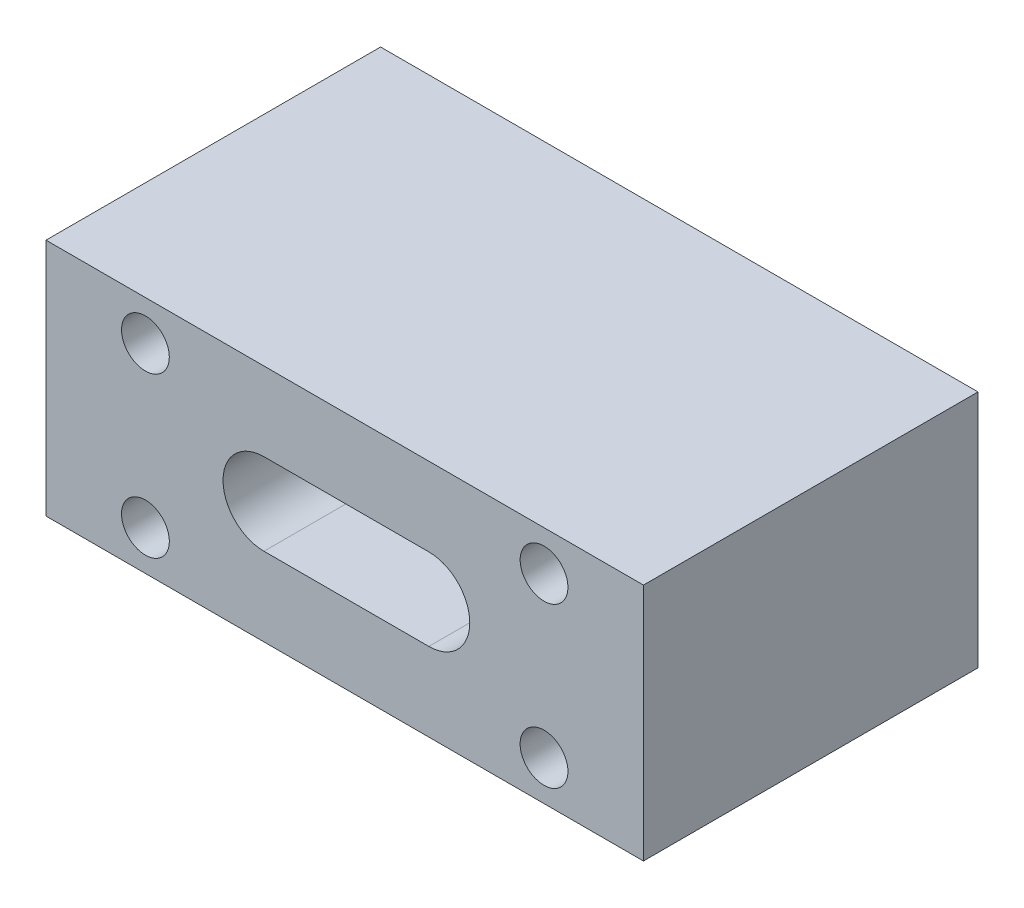
ISO-10303-21;
HEADER;
FILE_DESCRIPTION(('STEP AP214'),'2;1');
FILE_NAME('part.step','',(''),(''),'','','');
FILE_SCHEMA(('AUTOMOTIVE_DESIGN { 1 0 10303 214 1 1 1 1 }'));
ENDSEC;
DATA;
#1=APPLICATION_CONTEXT('core data for automotive mechanical design processes');
#2=APPLICATION_PROTOCOL_DEFINITION('international standard','automotive_design',2000,#1);
#3=PRODUCT_CONTEXT('',#1,'mechanical');
#4=PRODUCT('Part','Part','',(#3));
#5=PRODUCT_RELATED_PRODUCT_CATEGORY('part','',(#4));
#6=PRODUCT_DEFINITION_FORMATION('','',#4);
#7=PRODUCT_DEFINITION_CONTEXT('part definition',#1,'design');
#8=PRODUCT_DEFINITION('design','',#6,#7);
#9=PRODUCT_DEFINITION_SHAPE('','',#8);
#10=(LENGTH_UNIT() NAMED_UNIT(*) SI_UNIT(.MILLI.,.METRE.));
#11=(NAMED_UNIT(*) PLANE_ANGLE_UNIT() SI_UNIT($,.RADIAN.));
#12=(NAMED_UNIT(*) SI_UNIT($,.STERADIAN.) SOLID_ANGLE_UNIT());
#13=UNCERTAINTY_MEASURE_WITH_UNIT(LENGTH_MEASURE(1.E-05),#10,'distance_accuracy_value','');
#14=(GEOMETRIC_REPRESENTATION_CONTEXT(3) GLOBAL_UNCERTAINTY_ASSIGNED_CONTEXT((#13)) GLOBAL_UNIT_ASSIGNED_CONTEXT((#10,
#11,#12)) REPRESENTATION_CONTEXT('',''));
#15=CARTESIAN_POINT('',(0.,0.,0.));
#16=DIRECTION('',(0.,0.,1.));
#17=DIRECTION('',(1.,0.,0.));
#18=AXIS2_PLACEMENT_3D('',#15,#16,#17);
#19=CARTESIAN_POINT('',(0.,0.,140.));
#20=DIRECTION('',(0.,0.,-1.));
#21=DIRECTION('',(-1.,0.,0.));
#22=AXIS2_PLACEMENT_3D('',#19,#20,#21);
#23=PLANE('',#22);
#24=CARTESIAN_POINT('',(-83.4027541605512,33.3611016642205,140.));
#25=DIRECTION('',(0.,0.,1.));
#26=DIRECTION('',(1.,0.,0.));
#27=AXIS2_PLACEMENT_3D('',#24,#25,#26);
#28=CIRCLE('',#27,9.99999999999999);
#29=CARTESIAN_POINT('',(-73.4027541605512,33.3611016642205,140.));
#30=VERTEX_POINT('',#29);
#31=EDGE_CURVE('E137',#30,#30,#28,.T.);
#32=ORIENTED_EDGE('',*,*,#31,.F.);
#33=EDGE_LOOP('',(#32));
#34=FACE_BOUND('',#33,.T.);
#35=DIRECTION('',(0.,1.,0.));
#36=VECTOR('',#35,1.);
#37=CARTESIAN_POINT('',(125.,-50.,140.));
#38=LINE('',#37,#36);
#39=CARTESIAN_POINT('',(125.,-50.,140.));
#40=VERTEX_POINT('',#39);
#41=CARTESIAN_POINT('',(125.,50.,140.));
#42=VERTEX_POINT('',#41);
#43=EDGE_CURVE('E143',#40,#42,#38,.T.);
#44=ORIENTED_EDGE('',*,*,#43,.T.);
#45=DIRECTION('',(-1.,0.,0.));
#46=VECTOR('',#45,1.);
#47=CARTESIAN_POINT('',(-125.,50.,140.));
#48=LINE('',#47,#46);
#49=CARTESIAN_POINT('',(-125.,50.,140.));
#50=VERTEX_POINT('',#49);
#51=EDGE_CURVE('E146',#42,#50,#48,.T.);
#52=ORIENTED_EDGE('',*,*,#51,.T.);
#53=DIRECTION('',(0.,-1.,0.));
#54=VECTOR('',#53,1.);
#55=CARTESIAN_POINT('',(-125.,-50.,140.));
#56=LINE('',#55,#54);
#57=CARTESIAN_POINT('',(-125.,-50.,140.));
#58=VERTEX_POINT('',#57);
#59=EDGE_CURVE('E149',#50,#58,#56,.T.);
#60=ORIENTED_EDGE('',*,*,#59,.T.);
#61=DIRECTION('',(1.,0.,0.));
#62=VECTOR('',#61,1.);
#63=CARTESIAN_POINT('',(-125.,-50.,140.));
#64=LINE('',#63,#62);
#65=EDGE_CURVE('E151',#58,#40,#64,.T.);
#66=ORIENTED_EDGE('',*,*,#65,.T.);
#67=EDGE_LOOP('',(#44,#52,#60,#66));
#68=FACE_BOUND('',#67,.T.);
#69=CARTESIAN_POINT('',(-33.78724139003,0.,140.));
#70=DIRECTION('',(0.,0.,1.));
#71=DIRECTION('',(1.,0.,0.));
#72=AXIS2_PLACEMENT_3D('',#69,#70,#71);
#73=CIRCLE('',#72,17.1322263084548);
#74=CARTESIAN_POINT('',(-33.78724139003,17.1322263084548,140.));
#75=VERTEX_POINT('',#74);
#76=CARTESIAN_POINT('',(-33.78724139003,-17.1322263084548,140.));
#77=VERTEX_POINT('',#76);
#78=EDGE_CURVE('E98',#75,#77,#73,.T.);
#79=ORIENTED_EDGE('',*,*,#78,.F.);
#80=DIRECTION('',(-1.,0.,0.));
#81=VECTOR('',#80,1.);
#82=CARTESIAN_POINT('',(-33.78724139003,17.1322263084548,140.));
#83=LINE('',#82,#81);
#84=CARTESIAN_POINT('',(35.1968523552557,17.1322263084548,140.));
#85=VERTEX_POINT('',#84);
#86=EDGE_CURVE('E121',#85,#75,#83,.T.);
#87=ORIENTED_EDGE('',*,*,#86,.F.);
#88=CARTESIAN_POINT('',(35.1968523552557,0.,140.));
#89=DIRECTION('',(0.,0.,1.));
#90=DIRECTION('',(1.,0.,0.));
#91=AXIS2_PLACEMENT_3D('',#88,#89,#90);
#92=CIRCLE('',#91,17.1322263084548);
#93=CARTESIAN_POINT('',(35.1968523552557,-17.1322263084548,140.));
#94=VERTEX_POINT('',#93);
#95=EDGE_CURVE('E119',#94,#85,#92,.T.);
#96=ORIENTED_EDGE('',*,*,#95,.F.);
#97=DIRECTION('',(1.,0.,0.));
#98=VECTOR('',#97,1.);
#99=CARTESIAN_POINT('',(-33.78724139003,-17.1322263084548,140.));
#100=LINE('',#99,#98);
#101=EDGE_CURVE('E106',#77,#94,#100,.T.);
#102=ORIENTED_EDGE('',*,*,#101,.F.);
#103=EDGE_LOOP('',(#79,#87,#96,#102));
#104=FACE_BOUND('',#103,.T.);
#105=CARTESIAN_POINT('',(83.4027541605512,33.3611016642205,140.));
#106=DIRECTION('',(0.,0.,1.));
#107=DIRECTION('',(-1.,0.,0.));
#108=AXIS2_PLACEMENT_3D('',#105,#106,#107);
#109=CIRCLE('',#108,9.99999999999999);
#110=CARTESIAN_POINT('',(73.4027541605512,33.3611016642205,140.));
#111=VERTEX_POINT('',#110);
#112=EDGE_CURVE('E127',#111,#111,#109,.T.);
#113=ORIENTED_EDGE('',*,*,#112,.F.);
#114=EDGE_LOOP('',(#113));
#115=FACE_BOUND('',#114,.T.);
#116=CARTESIAN_POINT('',(83.4027541605512,-33.3611016642205,140.));
#117=DIRECTION('',(0.,0.,1.));
#118=DIRECTION('',(1.,0.,0.));
#119=AXIS2_PLACEMENT_3D('',#116,#117,#118);
#120=CIRCLE('',#119,9.99999999999999);
#121=CARTESIAN_POINT('',(93.4027541605511,-33.3611016642205,140.));
#122=VERTEX_POINT('',#121);
#123=EDGE_CURVE('E254',#122,#122,#120,.T.);
#124=ORIENTED_EDGE('',*,*,#123,.F.);
#125=EDGE_LOOP('',(#124));
#126=FACE_BOUND('',#125,.T.);
#127=CARTESIAN_POINT('',(-83.4027541605512,-33.3611016642205,140.));
#128=DIRECTION('',(0.,0.,1.));
#129=DIRECTION('',(-1.,0.,0.));
#130=AXIS2_PLACEMENT_3D('',#127,#128,#129);
#131=CIRCLE('',#130,9.99999999999999);
#132=CARTESIAN_POINT('',(-93.4027541605511,-33.3611016642205,140.));
#133=VERTEX_POINT('',#132);
#134=EDGE_CURVE('E245',#133,#133,#131,.T.);
#135=ORIENTED_EDGE('',*,*,#134,.F.);
#136=EDGE_LOOP('',(#135));
#137=FACE_BOUND('',#136,.T.);
#138=ADVANCED_FACE('F33',(#34,#68,#104,#115,#126,#137),#23,.F.);
#139=CARTESIAN_POINT('',(0.,0.,0.));
#140=DIRECTION('',(0.,0.,-1.));
#141=DIRECTION('',(-1.,0.,0.));
#142=AXIS2_PLACEMENT_3D('',#139,#140,#141);
#143=PLANE('',#142);
#144=CARTESIAN_POINT('',(83.4027541605512,-33.3611016642205,0.));
#145=DIRECTION('',(0.,0.,1.));
#146=DIRECTION('',(1.,0.,0.));
#147=AXIS2_PLACEMENT_3D('',#144,#145,#146);
#148=CIRCLE('',#147,9.99999999999999);
#149=CARTESIAN_POINT('',(93.4027541605511,-33.3611016642205,0.));
#150=VERTEX_POINT('',#149);
#151=EDGE_CURVE('E251',#150,#150,#148,.T.);
#152=ORIENTED_EDGE('',*,*,#151,.T.);
#153=EDGE_LOOP('',(#152));
#154=FACE_BOUND('',#153,.T.);
#155=DIRECTION('',(-1.,0.,0.));
#156=VECTOR('',#155,1.);
#157=CARTESIAN_POINT('',(-33.78724139003,17.1322263084548,0.));
#158=LINE('',#157,#156);
#159=CARTESIAN_POINT('',(35.1968523552557,17.1322263084548,0.));
#160=VERTEX_POINT('',#159);
#161=CARTESIAN_POINT('',(-33.78724139003,17.1322263084548,0.));
#162=VERTEX_POINT('',#161);
#163=EDGE_CURVE('E107',#160,#162,#158,.T.);
#164=ORIENTED_EDGE('',*,*,#163,.T.);
#165=CARTESIAN_POINT('',(-33.78724139003,0.,0.));
#166=DIRECTION('',(0.,0.,1.));
#167=DIRECTION('',(1.,0.,0.));
#168=AXIS2_PLACEMENT_3D('',#165,#166,#167);
#169=CIRCLE('',#168,17.1322263084548);
#170=CARTESIAN_POINT('',(-33.78724139003,-17.1322263084548,0.));
#171=VERTEX_POINT('',#170);
#172=EDGE_CURVE('E56',#162,#171,#169,.T.);
#173=ORIENTED_EDGE('',*,*,#172,.T.);
#174=DIRECTION('',(1.,0.,0.));
#175=VECTOR('',#174,1.);
#176=CARTESIAN_POINT('',(-33.78724139003,-17.1322263084548,0.));
#177=LINE('',#176,#175);
#178=CARTESIAN_POINT('',(35.1968523552557,-17.1322263084548,0.));
#179=VERTEX_POINT('',#178);
#180=EDGE_CURVE('E113',#171,#179,#177,.T.);
#181=ORIENTED_EDGE('',*,*,#180,.T.);
#182=CARTESIAN_POINT('',(35.1968523552557,0.,0.));
#183=DIRECTION('',(0.,0.,1.));
#184=DIRECTION('',(1.,0.,0.));
#185=AXIS2_PLACEMENT_3D('',#182,#183,#184);
#186=CIRCLE('',#185,17.1322263084548);
#187=EDGE_CURVE('E129',#179,#160,#186,.T.);
#188=ORIENTED_EDGE('',*,*,#187,.T.);
#189=EDGE_LOOP('',(#164,#173,#181,#188));
#190=FACE_BOUND('',#189,.T.);
#191=CARTESIAN_POINT('',(-83.4027541605512,33.3611016642205,0.));
#192=DIRECTION('',(0.,0.,1.));
#193=DIRECTION('',(1.,0.,0.));
#194=AXIS2_PLACEMENT_3D('',#191,#192,#193);
#195=CIRCLE('',#194,9.99999999999999);
#196=CARTESIAN_POINT('',(-73.4027541605512,33.3611016642205,0.));
#197=VERTEX_POINT('',#196);
#198=EDGE_CURVE('E114',#197,#197,#195,.T.);
#199=ORIENTED_EDGE('',*,*,#198,.T.);
#200=EDGE_LOOP('',(#199));
#201=FACE_BOUND('',#200,.T.);
#202=DIRECTION('',(0.,1.,0.));
#203=VECTOR('',#202,1.);
#204=CARTESIAN_POINT('',(125.,-50.,0.));
#205=LINE('',#204,#203);
#206=CARTESIAN_POINT('',(125.,-50.,0.));
#207=VERTEX_POINT('',#206);
#208=CARTESIAN_POINT('',(125.,50.,0.));
#209=VERTEX_POINT('',#208);
#210=EDGE_CURVE('E140',#207,#209,#205,.T.);
#211=ORIENTED_EDGE('',*,*,#210,.F.);
#212=DIRECTION('',(1.,0.,0.));
#213=VECTOR('',#212,1.);
#214=CARTESIAN_POINT('',(-125.,-50.,0.));
#215=LINE('',#214,#213);
#216=CARTESIAN_POINT('',(-125.,-50.,0.));
#217=VERTEX_POINT('',#216);
#218=EDGE_CURVE('E147',#217,#207,#215,.T.);
#219=ORIENTED_EDGE('',*,*,#218,.F.);
#220=DIRECTION('',(0.,-1.,0.));
#221=VECTOR('',#220,1.);
#222=CARTESIAN_POINT('',(-125.,-50.,0.));
#223=LINE('',#222,#221);
#224=CARTESIAN_POINT('',(-125.,50.,0.));
#225=VERTEX_POINT('',#224);
#226=EDGE_CURVE('E158',#225,#217,#223,.T.);
#227=ORIENTED_EDGE('',*,*,#226,.F.);
#228=DIRECTION('',(-1.,0.,0.));
#229=VECTOR('',#228,1.);
#230=CARTESIAN_POINT('',(-125.,50.,0.));
#231=LINE('',#230,#229);
#232=EDGE_CURVE('E156',#209,#225,#231,.T.);
#233=ORIENTED_EDGE('',*,*,#232,.F.);
#234=EDGE_LOOP('',(#211,#219,#227,#233));
#235=FACE_BOUND('',#234,.T.);
#236=CARTESIAN_POINT('',(83.4027541605512,33.3611016642205,0.));
#237=DIRECTION('',(0.,0.,1.));
#238=DIRECTION('',(-1.,0.,0.));
#239=AXIS2_PLACEMENT_3D('',#236,#237,#238);
#240=CIRCLE('',#239,9.99999999999999);
#241=CARTESIAN_POINT('',(73.4027541605512,33.3611016642205,0.));
#242=VERTEX_POINT('',#241);
#243=EDGE_CURVE('E257',#242,#242,#240,.T.);
#244=ORIENTED_EDGE('',*,*,#243,.T.);
#245=EDGE_LOOP('',(#244));
#246=FACE_BOUND('',#245,.T.);
#247=CARTESIAN_POINT('',(-83.4027541605512,-33.3611016642205,0.));
#248=DIRECTION('',(0.,0.,1.));
#249=DIRECTION('',(-1.,0.,0.));
#250=AXIS2_PLACEMENT_3D('',#247,#248,#249);
#251=CIRCLE('',#250,9.99999999999999);
#252=CARTESIAN_POINT('',(-93.4027541605511,-33.3611016642205,0.));
#253=VERTEX_POINT('',#252);
#254=EDGE_CURVE('E248',#253,#253,#251,.T.);
#255=ORIENTED_EDGE('',*,*,#254,.T.);
#256=EDGE_LOOP('',(#255));
#257=FACE_BOUND('',#256,.T.);
#258=ADVANCED_FACE('F176',(#154,#190,#201,#235,#246,#257),#143,.T.);
#259=CARTESIAN_POINT('',(125.,-50.,140.));
#260=DIRECTION('',(-1.,0.,0.));
#261=DIRECTION('',(0.,0.,1.));
#262=AXIS2_PLACEMENT_3D('',#259,#260,#261);
#263=PLANE('',#262);
#264=ORIENTED_EDGE('',*,*,#210,.T.);
#265=DIRECTION('',(0.,0.,-1.));
#266=VECTOR('',#265,1.);
#267=CARTESIAN_POINT('',(125.,50.,140.));
#268=LINE('',#267,#266);
#269=EDGE_CURVE('E11',#42,#209,#268,.T.);
#270=ORIENTED_EDGE('',*,*,#269,.F.);
#271=ORIENTED_EDGE('',*,*,#43,.F.);
#272=DIRECTION('',(0.,0.,-1.));
#273=VECTOR('',#272,1.);
#274=CARTESIAN_POINT('',(125.,-50.,140.));
#275=LINE('',#274,#273);
#276=EDGE_CURVE('E153',#40,#207,#275,.T.);
#277=ORIENTED_EDGE('',*,*,#276,.T.);
#278=EDGE_LOOP('',(#264,#270,#271,#277));
#279=FACE_BOUND('',#278,.T.);
#280=ADVANCED_FACE('F35',(#279),#263,.F.);
#281=CARTESIAN_POINT('',(-125.,50.,140.));
#282=DIRECTION('',(0.,-1.,0.));
#283=DIRECTION('',(0.,0.,-1.));
#284=AXIS2_PLACEMENT_3D('',#281,#282,#283);
#285=PLANE('',#284);
#286=ORIENTED_EDGE('',*,*,#232,.T.);
#287=DIRECTION('',(0.,0.,-1.));
#288=VECTOR('',#287,1.);
#289=CARTESIAN_POINT('',(-125.,50.,140.));
#290=LINE('',#289,#288);
#291=EDGE_CURVE('E41',#50,#225,#290,.T.);
#292=ORIENTED_EDGE('',*,*,#291,.F.);
#293=ORIENTED_EDGE('',*,*,#51,.F.);
#294=ORIENTED_EDGE('',*,*,#269,.T.);
#295=EDGE_LOOP('',(#286,#292,#293,#294));
#296=FACE_BOUND('',#295,.T.);
#297=ADVANCED_FACE('F186',(#296),#285,.F.);
#298=CARTESIAN_POINT('',(-125.,-50.,140.));
#299=DIRECTION('',(1.,0.,0.));
#300=DIRECTION('',(0.,0.,-1.));
#301=AXIS2_PLACEMENT_3D('',#298,#299,#300);
#302=PLANE('',#301);
#303=ORIENTED_EDGE('',*,*,#226,.T.);
#304=DIRECTION('',(0.,0.,-1.));
#305=VECTOR('',#304,1.);
#306=CARTESIAN_POINT('',(-125.,-50.,140.));
#307=LINE('',#306,#305);
#308=EDGE_CURVE('E163',#58,#217,#307,.T.);
#309=ORIENTED_EDGE('',*,*,#308,.F.);
#310=ORIENTED_EDGE('',*,*,#59,.F.);
#311=ORIENTED_EDGE('',*,*,#291,.T.);
#312=EDGE_LOOP('',(#303,#309,#310,#311));
#313=FACE_BOUND('',#312,.T.);
#314=ADVANCED_FACE('F170',(#313),#302,.F.);
#315=CARTESIAN_POINT('',(-125.,-50.,140.));
#316=DIRECTION('',(0.,1.,0.));
#317=DIRECTION('',(0.,0.,1.));
#318=AXIS2_PLACEMENT_3D('',#315,#316,#317);
#319=PLANE('',#318);
#320=ORIENTED_EDGE('',*,*,#218,.T.);
#321=ORIENTED_EDGE('',*,*,#276,.F.);
#322=ORIENTED_EDGE('',*,*,#65,.F.);
#323=ORIENTED_EDGE('',*,*,#308,.T.);
#324=EDGE_LOOP('',(#320,#321,#322,#323));
#325=FACE_BOUND('',#324,.T.);
#326=ADVANCED_FACE('F180',(#325),#319,.F.);
#327=CARTESIAN_POINT('',(-83.4027541605512,33.3611016642205,140.));
#328=DIRECTION('',(0.,0.,-1.));
#329=DIRECTION('',(-1.,0.,0.));
#330=AXIS2_PLACEMENT_3D('',#327,#328,#329);
#331=CYLINDRICAL_SURFACE('',#330,9.99999999999999);
#332=ORIENTED_EDGE('',*,*,#31,.T.);
#333=EDGE_LOOP('',(#332));
#334=FACE_BOUND('',#333,.T.);
#335=ORIENTED_EDGE('',*,*,#198,.F.);
#336=EDGE_LOOP('',(#335));
#337=FACE_BOUND('',#336,.T.);
#338=ADVANCED_FACE('F203',(#334,#337),#331,.F.);
#339=CARTESIAN_POINT('',(-33.78724139003,0.,140.));
#340=DIRECTION('',(0.,0.,-1.));
#341=DIRECTION('',(-1.,0.,0.));
#342=AXIS2_PLACEMENT_3D('',#339,#340,#341);
#343=CYLINDRICAL_SURFACE('',#342,17.1322263084548);
#344=ORIENTED_EDGE('',*,*,#172,.F.);
#345=DIRECTION('',(0.,0.,-1.));
#346=VECTOR('',#345,1.);
#347=CARTESIAN_POINT('',(-33.78724139003,17.1322263084548,140.));
#348=LINE('',#347,#346);
#349=EDGE_CURVE('E102',#75,#162,#348,.T.);
#350=ORIENTED_EDGE('',*,*,#349,.F.);
#351=ORIENTED_EDGE('',*,*,#78,.T.);
#352=DIRECTION('',(0.,0.,-1.));
#353=VECTOR('',#352,1.);
#354=CARTESIAN_POINT('',(-33.78724139003,-17.1322263084548,140.));
#355=LINE('',#354,#353);
#356=EDGE_CURVE('E101',#77,#171,#355,.T.);
#357=ORIENTED_EDGE('',*,*,#356,.T.);
#358=EDGE_LOOP('',(#344,#350,#351,#357));
#359=FACE_BOUND('',#358,.T.);
#360=ADVANCED_FACE('F100',(#359),#343,.F.);
#361=CARTESIAN_POINT('',(-33.78724139003,-17.1322263084548,140.));
#362=DIRECTION('',(0.,1.,0.));
#363=DIRECTION('',(0.,0.,1.));
#364=AXIS2_PLACEMENT_3D('',#361,#362,#363);
#365=PLANE('',#364);
#366=ORIENTED_EDGE('',*,*,#180,.F.);
#367=ORIENTED_EDGE('',*,*,#356,.F.);
#368=ORIENTED_EDGE('',*,*,#101,.T.);
#369=DIRECTION('',(0.,0.,-1.));
#370=VECTOR('',#369,1.);
#371=CARTESIAN_POINT('',(35.1968523552557,-17.1322263084548,140.));
#372=LINE('',#371,#370);
#373=EDGE_CURVE('E115',#94,#179,#372,.T.);
#374=ORIENTED_EDGE('',*,*,#373,.T.);
#375=EDGE_LOOP('',(#366,#367,#368,#374));
#376=FACE_BOUND('',#375,.T.);
#377=ADVANCED_FACE('F110',(#376),#365,.T.);
#378=CARTESIAN_POINT('',(35.1968523552557,0.,140.));
#379=DIRECTION('',(0.,0.,-1.));
#380=DIRECTION('',(-1.,0.,0.));
#381=AXIS2_PLACEMENT_3D('',#378,#379,#380);
#382=CYLINDRICAL_SURFACE('',#381,17.1322263084548);
#383=ORIENTED_EDGE('',*,*,#187,.F.);
#384=ORIENTED_EDGE('',*,*,#373,.F.);
#385=ORIENTED_EDGE('',*,*,#95,.T.);
#386=DIRECTION('',(0.,0.,-1.));
#387=VECTOR('',#386,1.);
#388=CARTESIAN_POINT('',(35.1968523552557,17.1322263084548,140.));
#389=LINE('',#388,#387);
#390=EDGE_CURVE('E48',#85,#160,#389,.T.);
#391=ORIENTED_EDGE('',*,*,#390,.T.);
#392=EDGE_LOOP('',(#383,#384,#385,#391));
#393=FACE_BOUND('',#392,.T.);
#394=ADVANCED_FACE('F220',(#393),#382,.F.);
#395=CARTESIAN_POINT('',(-33.78724139003,17.1322263084548,140.));
#396=DIRECTION('',(0.,-1.,0.));
#397=DIRECTION('',(0.,0.,-1.));
#398=AXIS2_PLACEMENT_3D('',#395,#396,#397);
#399=PLANE('',#398);
#400=ORIENTED_EDGE('',*,*,#163,.F.);
#401=ORIENTED_EDGE('',*,*,#390,.F.);
#402=ORIENTED_EDGE('',*,*,#86,.T.);
#403=ORIENTED_EDGE('',*,*,#349,.T.);
#404=EDGE_LOOP('',(#400,#401,#402,#403));
#405=FACE_BOUND('',#404,.T.);
#406=ADVANCED_FACE('F225',(#405),#399,.T.);
#407=CARTESIAN_POINT('',(83.4027541605512,33.3611016642205,140.));
#408=DIRECTION('',(0.,0.,-1.));
#409=DIRECTION('',(-1.,0.,0.));
#410=AXIS2_PLACEMENT_3D('',#407,#408,#409);
#411=CYLINDRICAL_SURFACE('',#410,9.99999999999999);
#412=ORIENTED_EDGE('',*,*,#112,.T.);
#413=EDGE_LOOP('',(#412));
#414=FACE_BOUND('',#413,.T.);
#415=ORIENTED_EDGE('',*,*,#243,.F.);
#416=EDGE_LOOP('',(#415));
#417=FACE_BOUND('',#416,.T.);
#418=ADVANCED_FACE('F229',(#414,#417),#411,.F.);
#419=CARTESIAN_POINT('',(83.4027541605512,-33.3611016642205,140.));
#420=DIRECTION('',(0.,0.,-1.));
#421=DIRECTION('',(-1.,0.,0.));
#422=AXIS2_PLACEMENT_3D('',#419,#420,#421);
#423=CYLINDRICAL_SURFACE('',#422,9.99999999999999);
#424=ORIENTED_EDGE('',*,*,#123,.T.);
#425=EDGE_LOOP('',(#424));
#426=FACE_BOUND('',#425,.T.);
#427=ORIENTED_EDGE('',*,*,#151,.F.);
#428=EDGE_LOOP('',(#427));
#429=FACE_BOUND('',#428,.T.);
#430=ADVANCED_FACE('F232',(#426,#429),#423,.F.);
#431=CARTESIAN_POINT('',(-83.4027541605512,-33.3611016642205,140.));
#432=DIRECTION('',(0.,0.,-1.));
#433=DIRECTION('',(-1.,0.,0.));
#434=AXIS2_PLACEMENT_3D('',#431,#432,#433);
#435=CYLINDRICAL_SURFACE('',#434,9.99999999999999);
#436=ORIENTED_EDGE('',*,*,#134,.T.);
#437=EDGE_LOOP('',(#436));
#438=FACE_BOUND('',#437,.T.);
#439=ORIENTED_EDGE('',*,*,#254,.F.);
#440=EDGE_LOOP('',(#439));
#441=FACE_BOUND('',#440,.T.);
#442=ADVANCED_FACE('F236',(#438,#441),#435,.F.);
#443=CLOSED_SHELL('',(#138,#258,#280,#297,#314,#326,#338,#360,#377,#394,#406,#418,#430,#442));
#444=MANIFOLD_SOLID_BREP('B2',#443);
#445=ADVANCED_BREP_SHAPE_REPRESENTATION('',(#18,#444),#14);
#446=SHAPE_DEFINITION_REPRESENTATION(#9,#445);
ENDSEC;
END-ISO-10303-21;
